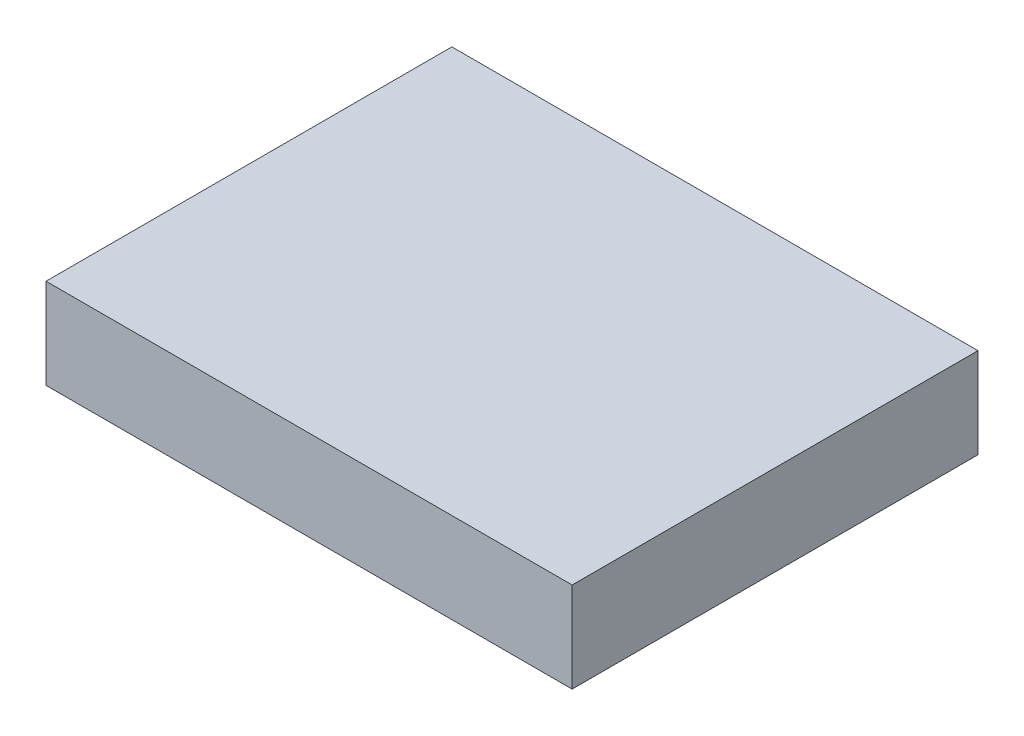
ISO-10303-21;
HEADER;
FILE_DESCRIPTION(('STEP AP214'),'2;1');
FILE_NAME('part.step','',(''),(''),'','','');
FILE_SCHEMA(('AUTOMOTIVE_DESIGN { 1 0 10303 214 1 1 1 1 }'));
ENDSEC;
DATA;
#1=APPLICATION_CONTEXT('core data for automotive mechanical design processes');
#2=APPLICATION_PROTOCOL_DEFINITION('international standard','automotive_design',2000,#1);
#3=PRODUCT_CONTEXT('',#1,'mechanical');
#4=PRODUCT('Part','Part','',(#3));
#5=PRODUCT_RELATED_PRODUCT_CATEGORY('part','',(#4));
#6=PRODUCT_DEFINITION_FORMATION('','',#4);
#7=PRODUCT_DEFINITION_CONTEXT('part definition',#1,'design');
#8=PRODUCT_DEFINITION('design','',#6,#7);
#9=PRODUCT_DEFINITION_SHAPE('','',#8);
#10=(LENGTH_UNIT() NAMED_UNIT(*) SI_UNIT(.MILLI.,.METRE.));
#11=(NAMED_UNIT(*) PLANE_ANGLE_UNIT() SI_UNIT($,.RADIAN.));
#12=(NAMED_UNIT(*) SI_UNIT($,.STERADIAN.) SOLID_ANGLE_UNIT());
#13=UNCERTAINTY_MEASURE_WITH_UNIT(LENGTH_MEASURE(1.E-05),#10,'distance_accuracy_value','');
#14=(GEOMETRIC_REPRESENTATION_CONTEXT(3) GLOBAL_UNCERTAINTY_ASSIGNED_CONTEXT((#13)) GLOBAL_UNIT_ASSIGNED_CONTEXT((#10,
#11,#12)) REPRESENTATION_CONTEXT('',''));
#15=CARTESIAN_POINT('',(0.,0.,0.));
#16=DIRECTION('',(0.,0.,1.));
#17=DIRECTION('',(1.,0.,0.));
#18=AXIS2_PLACEMENT_3D('',#15,#16,#17);
#19=CARTESIAN_POINT('',(35.,12.,-27.));
#20=DIRECTION('',(-1.,0.,0.));
#21=DIRECTION('',(0.,0.,1.));
#22=AXIS2_PLACEMENT_3D('',#19,#20,#21);
#23=PLANE('',#22);
#24=DIRECTION('',(0.,0.,-1.));
#25=VECTOR('',#24,1.);
#26=CARTESIAN_POINT('',(35.,0.,-27.));
#27=LINE('',#26,#25);
#28=CARTESIAN_POINT('',(35.,0.,27.));
#29=VERTEX_POINT('',#28);
#30=CARTESIAN_POINT('',(35.,0.,-27.));
#31=VERTEX_POINT('',#30);
#32=EDGE_CURVE('E107',#29,#31,#27,.T.);
#33=ORIENTED_EDGE('',*,*,#32,.T.);
#34=DIRECTION('',(0.,-1.,0.));
#35=VECTOR('',#34,1.);
#36=CARTESIAN_POINT('',(35.,12.,-27.));
#37=LINE('',#36,#35);
#38=CARTESIAN_POINT('',(35.,12.,-27.));
#39=VERTEX_POINT('',#38);
#40=EDGE_CURVE('E11',#39,#31,#37,.T.);
#41=ORIENTED_EDGE('',*,*,#40,.F.);
#42=DIRECTION('',(0.,0.,-1.));
#43=VECTOR('',#42,1.);
#44=CARTESIAN_POINT('',(35.,12.,-27.));
#45=LINE('',#44,#43);
#46=CARTESIAN_POINT('',(35.,12.,27.));
#47=VERTEX_POINT('',#46);
#48=EDGE_CURVE('E91',#47,#39,#45,.T.);
#49=ORIENTED_EDGE('',*,*,#48,.F.);
#50=DIRECTION('',(0.,-1.,0.));
#51=VECTOR('',#50,1.);
#52=CARTESIAN_POINT('',(35.,12.,27.));
#53=LINE('',#52,#51);
#54=EDGE_CURVE('E103',#47,#29,#53,.T.);
#55=ORIENTED_EDGE('',*,*,#54,.T.);
#56=EDGE_LOOP('',(#33,#41,#49,#55));
#57=FACE_BOUND('',#56,.T.);
#58=ADVANCED_FACE('F39',(#57),#23,.F.);
#59=CARTESIAN_POINT('',(-35.,12.,-27.));
#60=DIRECTION('',(0.,0.,1.));
#61=DIRECTION('',(1.,0.,0.));
#62=AXIS2_PLACEMENT_3D('',#59,#60,#61);
#63=PLANE('',#62);
#64=DIRECTION('',(-1.,0.,0.));
#65=VECTOR('',#64,1.);
#66=CARTESIAN_POINT('',(-35.,0.,-27.));
#67=LINE('',#66,#65);
#68=CARTESIAN_POINT('',(-35.,0.,-27.));
#69=VERTEX_POINT('',#68);
#70=EDGE_CURVE('E96',#31,#69,#67,.T.);
#71=ORIENTED_EDGE('',*,*,#70,.T.);
#72=DIRECTION('',(0.,-1.,0.));
#73=VECTOR('',#72,1.);
#74=CARTESIAN_POINT('',(-35.,12.,-27.));
#75=LINE('',#74,#73);
#76=CARTESIAN_POINT('',(-35.,12.,-27.));
#77=VERTEX_POINT('',#76);
#78=EDGE_CURVE('E48',#77,#69,#75,.T.);
#79=ORIENTED_EDGE('',*,*,#78,.F.);
#80=DIRECTION('',(-1.,0.,0.));
#81=VECTOR('',#80,1.);
#82=CARTESIAN_POINT('',(-35.,12.,-27.));
#83=LINE('',#82,#81);
#84=EDGE_CURVE('E86',#39,#77,#83,.T.);
#85=ORIENTED_EDGE('',*,*,#84,.F.);
#86=ORIENTED_EDGE('',*,*,#40,.T.);
#87=EDGE_LOOP('',(#71,#79,#85,#86));
#88=FACE_BOUND('',#87,.T.);
#89=ADVANCED_FACE('F95',(#88),#63,.F.);
#90=CARTESIAN_POINT('',(-35.,12.,-27.));
#91=DIRECTION('',(1.,0.,0.));
#92=DIRECTION('',(0.,0.,-1.));
#93=AXIS2_PLACEMENT_3D('',#90,#91,#92);
#94=PLANE('',#93);
#95=DIRECTION('',(0.,0.,1.));
#96=VECTOR('',#95,1.);
#97=CARTESIAN_POINT('',(-35.,0.,-27.));
#98=LINE('',#97,#96);
#99=CARTESIAN_POINT('',(-35.,0.,27.));
#100=VERTEX_POINT('',#99);
#101=EDGE_CURVE('E73',#69,#100,#98,.T.);
#102=ORIENTED_EDGE('',*,*,#101,.T.);
#103=DIRECTION('',(0.,-1.,0.));
#104=VECTOR('',#103,1.);
#105=CARTESIAN_POINT('',(-35.,12.,27.));
#106=LINE('',#105,#104);
#107=CARTESIAN_POINT('',(-35.,12.,27.));
#108=VERTEX_POINT('',#107);
#109=EDGE_CURVE('E98',#108,#100,#106,.T.);
#110=ORIENTED_EDGE('',*,*,#109,.F.);
#111=DIRECTION('',(0.,0.,1.));
#112=VECTOR('',#111,1.);
#113=CARTESIAN_POINT('',(-35.,12.,-27.));
#114=LINE('',#113,#112);
#115=EDGE_CURVE('E89',#77,#108,#114,.T.);
#116=ORIENTED_EDGE('',*,*,#115,.F.);
#117=ORIENTED_EDGE('',*,*,#78,.T.);
#118=EDGE_LOOP('',(#102,#110,#116,#117));
#119=FACE_BOUND('',#118,.T.);
#120=ADVANCED_FACE('F99',(#119),#94,.F.);
#121=CARTESIAN_POINT('',(-35.,12.,27.));
#122=DIRECTION('',(0.,0.,-1.));
#123=DIRECTION('',(-1.,0.,0.));
#124=AXIS2_PLACEMENT_3D('',#121,#122,#123);
#125=PLANE('',#124);
#126=DIRECTION('',(1.,0.,0.));
#127=VECTOR('',#126,1.);
#128=CARTESIAN_POINT('',(-35.,0.,27.));
#129=LINE('',#128,#127);
#130=EDGE_CURVE('E79',#100,#29,#129,.T.);
#131=ORIENTED_EDGE('',*,*,#130,.T.);
#132=ORIENTED_EDGE('',*,*,#54,.F.);
#133=DIRECTION('',(1.,0.,0.));
#134=VECTOR('',#133,1.);
#135=CARTESIAN_POINT('',(-35.,12.,27.));
#136=LINE('',#135,#134);
#137=EDGE_CURVE('E56',#108,#47,#136,.T.);
#138=ORIENTED_EDGE('',*,*,#137,.F.);
#139=ORIENTED_EDGE('',*,*,#109,.T.);
#140=EDGE_LOOP('',(#131,#132,#138,#139));
#141=FACE_BOUND('',#140,.T.);
#142=ADVANCED_FACE('F120',(#141),#125,.F.);
#143=CARTESIAN_POINT('',(0.,12.,0.));
#144=DIRECTION('',(0.,1.,0.));
#145=DIRECTION('',(0.,0.,1.));
#146=AXIS2_PLACEMENT_3D('',#143,#144,#145);
#147=PLANE('',#146);
#148=ORIENTED_EDGE('',*,*,#48,.T.);
#149=ORIENTED_EDGE('',*,*,#84,.T.);
#150=ORIENTED_EDGE('',*,*,#115,.T.);
#151=ORIENTED_EDGE('',*,*,#137,.T.);
#152=EDGE_LOOP('',(#148,#149,#150,#151));
#153=FACE_BOUND('',#152,.T.);
#154=ADVANCED_FACE('F87',(#153),#147,.T.);
#155=CARTESIAN_POINT('',(0.,0.,0.));
#156=DIRECTION('',(0.,1.,0.));
#157=DIRECTION('',(0.,0.,1.));
#158=AXIS2_PLACEMENT_3D('',#155,#156,#157);
#159=PLANE('',#158);
#160=ORIENTED_EDGE('',*,*,#32,.F.);
#161=ORIENTED_EDGE('',*,*,#130,.F.);
#162=ORIENTED_EDGE('',*,*,#101,.F.);
#163=ORIENTED_EDGE('',*,*,#70,.F.);
#164=EDGE_LOOP('',(#160,#161,#162,#163));
#165=FACE_BOUND('',#164,.T.);
#166=ADVANCED_FACE('F123',(#165),#159,.F.);
#167=CLOSED_SHELL('',(#58,#89,#120,#142,#154,#166));
#168=MANIFOLD_SOLID_BREP('B2',#167);
#169=ADVANCED_BREP_SHAPE_REPRESENTATION('',(#18,#168),#14);
#170=SHAPE_DEFINITION_REPRESENTATION(#9,#169);
ENDSEC;
END-ISO-10303-21;
